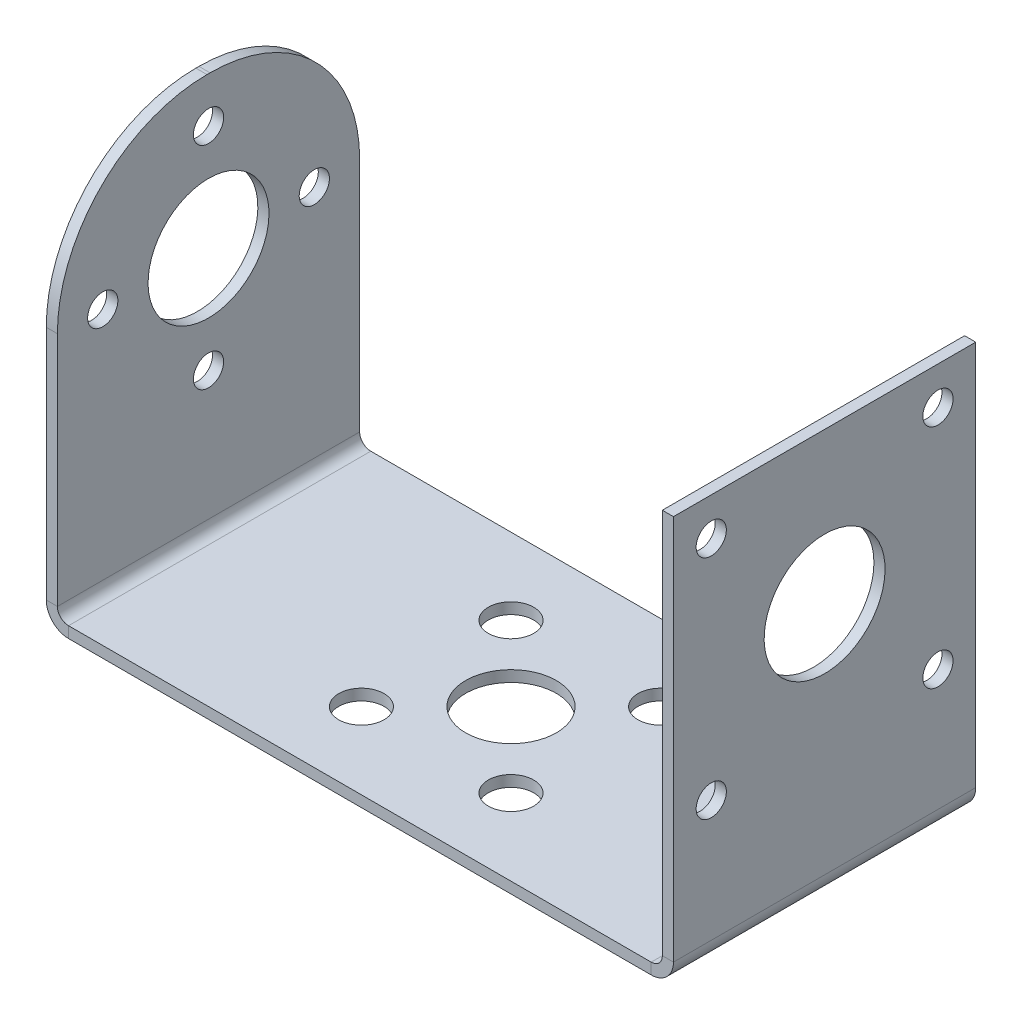
ISO-10303-21;
HEADER;
FILE_DESCRIPTION(('STEP AP214'),'2;1');
FILE_NAME('part.step','',(''),(''),'','','');
FILE_SCHEMA(('AUTOMOTIVE_DESIGN { 1 0 10303 214 1 1 1 1 }'));
ENDSEC;
DATA;
#1=APPLICATION_CONTEXT('core data for automotive mechanical design processes');
#2=APPLICATION_PROTOCOL_DEFINITION('international standard','automotive_design',2000,#1);
#3=PRODUCT_CONTEXT('',#1,'mechanical');
#4=PRODUCT('Part','Part','',(#3));
#5=PRODUCT_RELATED_PRODUCT_CATEGORY('part','',(#4));
#6=PRODUCT_DEFINITION_FORMATION('','',#4);
#7=PRODUCT_DEFINITION_CONTEXT('part definition',#1,'design');
#8=PRODUCT_DEFINITION('design','',#6,#7);
#9=PRODUCT_DEFINITION_SHAPE('','',#8);
#10=(LENGTH_UNIT() NAMED_UNIT(*) SI_UNIT(.MILLI.,.METRE.));
#11=(NAMED_UNIT(*) PLANE_ANGLE_UNIT() SI_UNIT($,.RADIAN.));
#12=(NAMED_UNIT(*) SI_UNIT($,.STERADIAN.) SOLID_ANGLE_UNIT());
#13=UNCERTAINTY_MEASURE_WITH_UNIT(LENGTH_MEASURE(1.E-05),#10,'distance_accuracy_value','');
#14=(GEOMETRIC_REPRESENTATION_CONTEXT(3) GLOBAL_UNCERTAINTY_ASSIGNED_CONTEXT((#13)) GLOBAL_UNIT_ASSIGNED_CONTEXT((#10,
#11,#12)) REPRESENTATION_CONTEXT('',''));
#15=CARTESIAN_POINT('',(0.,0.,0.));
#16=DIRECTION('',(0.,0.,1.));
#17=DIRECTION('',(1.,0.,0.));
#18=AXIS2_PLACEMENT_3D('',#15,#16,#17);
#19=CARTESIAN_POINT('',(0.,-0.7366,0.));
#20=DIRECTION('',(0.,1.,0.));
#21=DIRECTION('',(0.,0.,1.));
#22=AXIS2_PLACEMENT_3D('',#19,#20,#21);
#23=PLANE('',#22);
#24=CARTESIAN_POINT('',(4.94950000000001,-0.7366,4.9495));
#25=DIRECTION('',(0.,1.,0.));
#26=DIRECTION('',(0.,0.,1.));
#27=AXIS2_PLACEMENT_3D('',#24,#25,#26);
#28=CIRCLE('',#27,1.5);
#29=CARTESIAN_POINT('',(4.94950000000001,-0.7366,6.4495));
#30=VERTEX_POINT('',#29);
#31=EDGE_CURVE('E356',#30,#30,#28,.T.);
#32=ORIENTED_EDGE('',*,*,#31,.T.);
#33=EDGE_LOOP('',(#32));
#34=FACE_BOUND('',#33,.T.);
#35=CARTESIAN_POINT('',(-4.94949999999999,-0.7366,4.9495));
#36=DIRECTION('',(0.,1.,0.));
#37=DIRECTION('',(0.,0.,1.));
#38=AXIS2_PLACEMENT_3D('',#35,#36,#37);
#39=CIRCLE('',#38,1.5);
#40=CARTESIAN_POINT('',(-4.94949999999999,-0.7366,6.4495));
#41=VERTEX_POINT('',#40);
#42=EDGE_CURVE('E362',#41,#41,#39,.T.);
#43=ORIENTED_EDGE('',*,*,#42,.T.);
#44=EDGE_LOOP('',(#43));
#45=FACE_BOUND('',#44,.T.);
#46=CARTESIAN_POINT('',(-4.94949999999999,-0.7366,-4.9495));
#47=DIRECTION('',(0.,1.,0.));
#48=DIRECTION('',(0.,0.,1.));
#49=AXIS2_PLACEMENT_3D('',#46,#47,#48);
#50=CIRCLE('',#49,1.5);
#51=CARTESIAN_POINT('',(-4.94949999999999,-0.7366,-3.4495));
#52=VERTEX_POINT('',#51);
#53=EDGE_CURVE('E368',#52,#52,#50,.T.);
#54=ORIENTED_EDGE('',*,*,#53,.T.);
#55=EDGE_LOOP('',(#54));
#56=FACE_BOUND('',#55,.T.);
#57=CARTESIAN_POINT('',(4.94950000000001,-0.7366,-4.9495));
#58=DIRECTION('',(0.,1.,0.));
#59=DIRECTION('',(0.,0.,1.));
#60=AXIS2_PLACEMENT_3D('',#57,#58,#59);
#61=CIRCLE('',#60,1.5);
#62=CARTESIAN_POINT('',(4.94950000000001,-0.7366,-3.4495));
#63=VERTEX_POINT('',#62);
#64=EDGE_CURVE('E374',#63,#63,#61,.T.);
#65=ORIENTED_EDGE('',*,*,#64,.T.);
#66=EDGE_LOOP('',(#65));
#67=FACE_BOUND('',#66,.T.);
#68=CARTESIAN_POINT('',(0.,-0.7366,0.));
#69=DIRECTION('',(0.,1.,0.));
#70=DIRECTION('',(0.,0.,1.));
#71=AXIS2_PLACEMENT_3D('',#68,#69,#70);
#72=CIRCLE('',#71,3.);
#73=CARTESIAN_POINT('',(0.,-0.7366,3.));
#74=VERTEX_POINT('',#73);
#75=EDGE_CURVE('E380',#74,#74,#72,.T.);
#76=ORIENTED_EDGE('',*,*,#75,.T.);
#77=EDGE_LOOP('',(#76));
#78=FACE_BOUND('',#77,.T.);
#79=DIRECTION('',(0.,0.,-1.));
#80=VECTOR('',#79,1.);
#81=CARTESIAN_POINT('',(19.2768,-0.736600000000001,-10.));
#82=LINE('',#81,#80);
#83=CARTESIAN_POINT('',(19.2768,-0.736600000000001,-10.));
#84=VERTEX_POINT('',#83);
#85=CARTESIAN_POINT('',(19.2768,-0.7366,10.));
#86=VERTEX_POINT('',#85);
#87=EDGE_CURVE('E238',#84,#86,#82,.F.);
#88=ORIENTED_EDGE('',*,*,#87,.T.);
#89=DIRECTION('',(1.,0.,0.));
#90=VECTOR('',#89,1.);
#91=CARTESIAN_POINT('',(-20.75,-0.7366,10.));
#92=LINE('',#91,#90);
#93=CARTESIAN_POINT('',(-19.2768,-0.736600000000001,10.));
#94=VERTEX_POINT('',#93);
#95=EDGE_CURVE('E13',#94,#86,#92,.T.);
#96=ORIENTED_EDGE('',*,*,#95,.F.);
#97=DIRECTION('',(0.,0.,1.));
#98=VECTOR('',#97,1.);
#99=CARTESIAN_POINT('',(-19.2768,-0.736600000000001,10.));
#100=LINE('',#99,#98);
#101=CARTESIAN_POINT('',(-19.2768,-0.7366,-10.));
#102=VERTEX_POINT('',#101);
#103=EDGE_CURVE('E335',#94,#102,#100,.F.);
#104=ORIENTED_EDGE('',*,*,#103,.T.);
#105=DIRECTION('',(-1.,0.,0.));
#106=VECTOR('',#105,1.);
#107=CARTESIAN_POINT('',(-20.75,-0.7366,-10.));
#108=LINE('',#107,#106);
#109=EDGE_CURVE('E102',#84,#102,#108,.T.);
#110=ORIENTED_EDGE('',*,*,#109,.F.);
#111=EDGE_LOOP('',(#88,#96,#104,#110));
#112=FACE_BOUND('',#111,.T.);
#113=ADVANCED_FACE('F93',(#34,#45,#56,#67,#78,#112),#23,.F.);
#114=CARTESIAN_POINT('',(0.,0.,0.));
#115=DIRECTION('',(0.,1.,0.));
#116=DIRECTION('',(0.,0.,1.));
#117=AXIS2_PLACEMENT_3D('',#114,#115,#116);
#118=PLANE('',#117);
#119=CARTESIAN_POINT('',(4.94950000000001,0.,4.9495));
#120=DIRECTION('',(0.,1.,0.));
#121=DIRECTION('',(0.,0.,1.));
#122=AXIS2_PLACEMENT_3D('',#119,#120,#121);
#123=CIRCLE('',#122,1.5);
#124=CARTESIAN_POINT('',(4.94950000000001,0.,6.4495));
#125=VERTEX_POINT('',#124);
#126=EDGE_CURVE('E353',#125,#125,#123,.T.);
#127=ORIENTED_EDGE('',*,*,#126,.F.);
#128=EDGE_LOOP('',(#127));
#129=FACE_BOUND('',#128,.T.);
#130=CARTESIAN_POINT('',(-4.94949999999999,0.,4.9495));
#131=DIRECTION('',(0.,1.,0.));
#132=DIRECTION('',(0.,0.,1.));
#133=AXIS2_PLACEMENT_3D('',#130,#131,#132);
#134=CIRCLE('',#133,1.5);
#135=CARTESIAN_POINT('',(-4.94949999999999,0.,6.4495));
#136=VERTEX_POINT('',#135);
#137=EDGE_CURVE('E359',#136,#136,#134,.T.);
#138=ORIENTED_EDGE('',*,*,#137,.F.);
#139=EDGE_LOOP('',(#138));
#140=FACE_BOUND('',#139,.T.);
#141=CARTESIAN_POINT('',(-4.94949999999999,0.,-4.9495));
#142=DIRECTION('',(0.,1.,0.));
#143=DIRECTION('',(0.,0.,1.));
#144=AXIS2_PLACEMENT_3D('',#141,#142,#143);
#145=CIRCLE('',#144,1.5);
#146=CARTESIAN_POINT('',(-4.94949999999999,0.,-3.4495));
#147=VERTEX_POINT('',#146);
#148=EDGE_CURVE('E365',#147,#147,#145,.T.);
#149=ORIENTED_EDGE('',*,*,#148,.F.);
#150=EDGE_LOOP('',(#149));
#151=FACE_BOUND('',#150,.T.);
#152=CARTESIAN_POINT('',(4.94950000000001,0.,-4.9495));
#153=DIRECTION('',(0.,1.,0.));
#154=DIRECTION('',(0.,0.,1.));
#155=AXIS2_PLACEMENT_3D('',#152,#153,#154);
#156=CIRCLE('',#155,1.5);
#157=CARTESIAN_POINT('',(4.94950000000001,0.,-3.4495));
#158=VERTEX_POINT('',#157);
#159=EDGE_CURVE('E371',#158,#158,#156,.T.);
#160=ORIENTED_EDGE('',*,*,#159,.F.);
#161=EDGE_LOOP('',(#160));
#162=FACE_BOUND('',#161,.T.);
#163=CARTESIAN_POINT('',(0.,0.,0.));
#164=DIRECTION('',(0.,1.,0.));
#165=DIRECTION('',(0.,0.,1.));
#166=AXIS2_PLACEMENT_3D('',#163,#164,#165);
#167=CIRCLE('',#166,3.);
#168=CARTESIAN_POINT('',(0.,0.,3.));
#169=VERTEX_POINT('',#168);
#170=EDGE_CURVE('E377',#169,#169,#167,.T.);
#171=ORIENTED_EDGE('',*,*,#170,.F.);
#172=EDGE_LOOP('',(#171));
#173=FACE_BOUND('',#172,.T.);
#174=DIRECTION('',(1.,0.,0.));
#175=VECTOR('',#174,1.);
#176=CARTESIAN_POINT('',(-20.75,0.,10.));
#177=LINE('',#176,#175);
#178=CARTESIAN_POINT('',(-19.2768,0.,10.));
#179=VERTEX_POINT('',#178);
#180=CARTESIAN_POINT('',(19.2768,0.,10.));
#181=VERTEX_POINT('',#180);
#182=EDGE_CURVE('E386',#179,#181,#177,.T.);
#183=ORIENTED_EDGE('',*,*,#182,.T.);
#184=DIRECTION('',(0.,0.,-1.));
#185=VECTOR('',#184,1.);
#186=CARTESIAN_POINT('',(19.2768,0.,-10.));
#187=LINE('',#186,#185);
#188=CARTESIAN_POINT('',(19.2768,0.,-10.));
#189=VERTEX_POINT('',#188);
#190=EDGE_CURVE('E250',#189,#181,#187,.F.);
#191=ORIENTED_EDGE('',*,*,#190,.F.);
#192=DIRECTION('',(-1.,0.,0.));
#193=VECTOR('',#192,1.);
#194=CARTESIAN_POINT('',(-20.75,0.,-10.));
#195=LINE('',#194,#193);
#196=CARTESIAN_POINT('',(-19.2768,0.,-10.));
#197=VERTEX_POINT('',#196);
#198=EDGE_CURVE('E383',#189,#197,#195,.T.);
#199=ORIENTED_EDGE('',*,*,#198,.T.);
#200=DIRECTION('',(0.,0.,1.));
#201=VECTOR('',#200,1.);
#202=CARTESIAN_POINT('',(-19.2768,0.,10.));
#203=LINE('',#202,#201);
#204=EDGE_CURVE('E110',#179,#197,#203,.F.);
#205=ORIENTED_EDGE('',*,*,#204,.F.);
#206=EDGE_LOOP('',(#183,#191,#199,#205));
#207=FACE_BOUND('',#206,.T.);
#208=ADVANCED_FACE('F464',(#129,#140,#151,#162,#173,#207),#118,.T.);
#209=CARTESIAN_POINT('',(-20.75,-0.7366,-10.));
#210=DIRECTION('',(0.,0.,-1.));
#211=DIRECTION('',(-1.,0.,0.));
#212=AXIS2_PLACEMENT_3D('',#209,#210,#211);
#213=PLANE('',#212);
#214=ORIENTED_EDGE('',*,*,#198,.F.);
#215=DIRECTION('',(0.,-1.,0.));
#216=VECTOR('',#215,1.);
#217=CARTESIAN_POINT('',(19.2768,0.,-10.));
#218=LINE('',#217,#216);
#219=EDGE_CURVE('E244',#189,#84,#218,.T.);
#220=ORIENTED_EDGE('',*,*,#219,.T.);
#221=ORIENTED_EDGE('',*,*,#109,.T.);
#222=DIRECTION('',(0.,-1.,0.));
#223=VECTOR('',#222,1.);
#224=CARTESIAN_POINT('',(-19.2768,0.,-10.));
#225=LINE('',#224,#223);
#226=EDGE_CURVE('E350',#197,#102,#225,.T.);
#227=ORIENTED_EDGE('',*,*,#226,.F.);
#228=EDGE_LOOP('',(#214,#220,#221,#227));
#229=FACE_BOUND('',#228,.T.);
#230=ADVANCED_FACE('F95',(#229),#213,.T.);
#231=CARTESIAN_POINT('',(-20.75,-0.7366,10.));
#232=DIRECTION('',(0.,0.,1.));
#233=DIRECTION('',(1.,0.,0.));
#234=AXIS2_PLACEMENT_3D('',#231,#232,#233);
#235=PLANE('',#234);
#236=DIRECTION('',(0.,-1.,0.));
#237=VECTOR('',#236,1.);
#238=CARTESIAN_POINT('',(19.2768,0.,10.));
#239=LINE('',#238,#237);
#240=EDGE_CURVE('E256',#181,#86,#239,.T.);
#241=ORIENTED_EDGE('',*,*,#240,.F.);
#242=ORIENTED_EDGE('',*,*,#182,.F.);
#243=DIRECTION('',(0.,-1.,0.));
#244=VECTOR('',#243,1.);
#245=CARTESIAN_POINT('',(-19.2768,0.,10.));
#246=LINE('',#245,#244);
#247=EDGE_CURVE('E341',#179,#94,#246,.T.);
#248=ORIENTED_EDGE('',*,*,#247,.T.);
#249=ORIENTED_EDGE('',*,*,#95,.T.);
#250=EDGE_LOOP('',(#241,#242,#248,#249));
#251=FACE_BOUND('',#250,.T.);
#252=ADVANCED_FACE('F476',(#251),#235,.T.);
#253=CARTESIAN_POINT('',(0.,-0.7366,0.));
#254=DIRECTION('',(0.,1.,0.));
#255=DIRECTION('',(0.,0.,1.));
#256=AXIS2_PLACEMENT_3D('',#253,#254,#255);
#257=CYLINDRICAL_SURFACE('',#256,3.);
#258=ORIENTED_EDGE('',*,*,#75,.F.);
#259=EDGE_LOOP('',(#258));
#260=FACE_BOUND('',#259,.T.);
#261=ORIENTED_EDGE('',*,*,#170,.T.);
#262=EDGE_LOOP('',(#261));
#263=FACE_BOUND('',#262,.T.);
#264=ADVANCED_FACE('F474',(#260,#263),#257,.F.);
#265=CARTESIAN_POINT('',(4.94950000000001,-0.7366,-4.9495));
#266=DIRECTION('',(0.,1.,0.));
#267=DIRECTION('',(0.,0.,1.));
#268=AXIS2_PLACEMENT_3D('',#265,#266,#267);
#269=CYLINDRICAL_SURFACE('',#268,1.5);
#270=ORIENTED_EDGE('',*,*,#64,.F.);
#271=EDGE_LOOP('',(#270));
#272=FACE_BOUND('',#271,.T.);
#273=ORIENTED_EDGE('',*,*,#159,.T.);
#274=EDGE_LOOP('',(#273));
#275=FACE_BOUND('',#274,.T.);
#276=ADVANCED_FACE('F483',(#272,#275),#269,.F.);
#277=CARTESIAN_POINT('',(-4.94949999999999,-0.7366,-4.9495));
#278=DIRECTION('',(0.,1.,0.));
#279=DIRECTION('',(0.,0.,1.));
#280=AXIS2_PLACEMENT_3D('',#277,#278,#279);
#281=CYLINDRICAL_SURFACE('',#280,1.5);
#282=ORIENTED_EDGE('',*,*,#53,.F.);
#283=EDGE_LOOP('',(#282));
#284=FACE_BOUND('',#283,.T.);
#285=ORIENTED_EDGE('',*,*,#148,.T.);
#286=EDGE_LOOP('',(#285));
#287=FACE_BOUND('',#286,.T.);
#288=ADVANCED_FACE('F570',(#284,#287),#281,.F.);
#289=CARTESIAN_POINT('',(-4.94949999999999,-0.7366,4.9495));
#290=DIRECTION('',(0.,1.,0.));
#291=DIRECTION('',(0.,0.,1.));
#292=AXIS2_PLACEMENT_3D('',#289,#290,#291);
#293=CYLINDRICAL_SURFACE('',#292,1.5);
#294=ORIENTED_EDGE('',*,*,#42,.F.);
#295=EDGE_LOOP('',(#294));
#296=FACE_BOUND('',#295,.T.);
#297=ORIENTED_EDGE('',*,*,#137,.T.);
#298=EDGE_LOOP('',(#297));
#299=FACE_BOUND('',#298,.T.);
#300=ADVANCED_FACE('F566',(#296,#299),#293,.F.);
#301=CARTESIAN_POINT('',(4.94950000000001,-0.7366,4.9495));
#302=DIRECTION('',(0.,1.,0.));
#303=DIRECTION('',(0.,0.,1.));
#304=AXIS2_PLACEMENT_3D('',#301,#302,#303);
#305=CYLINDRICAL_SURFACE('',#304,1.5);
#306=ORIENTED_EDGE('',*,*,#31,.F.);
#307=EDGE_LOOP('',(#306));
#308=FACE_BOUND('',#307,.T.);
#309=ORIENTED_EDGE('',*,*,#126,.T.);
#310=EDGE_LOOP('',(#309));
#311=FACE_BOUND('',#310,.T.);
#312=ADVANCED_FACE('F561',(#308,#311),#305,.F.);
#313=CARTESIAN_POINT('',(-19.2768,0.7366,-10.));
#314=DIRECTION('',(0.,0.,-1.));
#315=DIRECTION('',(-1.,0.,0.));
#316=AXIS2_PLACEMENT_3D('',#313,#314,#315);
#317=PLANE('',#316);
#318=DIRECTION('',(1.,0.,0.));
#319=VECTOR('',#318,1.);
#320=CARTESIAN_POINT('',(-20.75,0.736599999999994,-10.));
#321=LINE('',#320,#319);
#322=CARTESIAN_POINT('',(-20.0134,0.736599999999997,-10.));
#323=VERTEX_POINT('',#322);
#324=CARTESIAN_POINT('',(-20.75,0.736599999999994,-10.));
#325=VERTEX_POINT('',#324);
#326=EDGE_CURVE('E259',#323,#325,#321,.F.);
#327=ORIENTED_EDGE('',*,*,#326,.F.);
#328=CARTESIAN_POINT('',(-19.2768,0.7366,-10.));
#329=DIRECTION('',(0.,0.,1.));
#330=DIRECTION('',(1.,0.,0.));
#331=AXIS2_PLACEMENT_3D('',#328,#329,#330);
#332=CIRCLE('',#331,0.7366);
#333=EDGE_CURVE('E344',#197,#323,#332,.F.);
#334=ORIENTED_EDGE('',*,*,#333,.F.);
#335=ORIENTED_EDGE('',*,*,#226,.T.);
#336=CARTESIAN_POINT('',(-19.2768,0.7366,-10.));
#337=DIRECTION('',(0.,0.,1.));
#338=DIRECTION('',(1.,0.,0.));
#339=AXIS2_PLACEMENT_3D('',#336,#337,#338);
#340=CIRCLE('',#339,1.4732);
#341=EDGE_CURVE('E337',#102,#325,#340,.F.);
#342=ORIENTED_EDGE('',*,*,#341,.T.);
#343=EDGE_LOOP('',(#327,#334,#335,#342));
#344=FACE_BOUND('',#343,.T.);
#345=ADVANCED_FACE('F506',(#344),#317,.T.);
#346=CARTESIAN_POINT('',(-19.2768,0.7366,10.));
#347=DIRECTION('',(0.,0.,-1.));
#348=DIRECTION('',(-1.,0.,0.));
#349=AXIS2_PLACEMENT_3D('',#346,#347,#348);
#350=PLANE('',#349);
#351=CARTESIAN_POINT('',(-19.2768,0.7366,10.));
#352=DIRECTION('',(0.,0.,1.));
#353=DIRECTION('',(1.,0.,0.));
#354=AXIS2_PLACEMENT_3D('',#351,#352,#353);
#355=CIRCLE('',#354,0.7366);
#356=CARTESIAN_POINT('',(-20.0134,0.736599999999997,10.));
#357=VERTEX_POINT('',#356);
#358=EDGE_CURVE('E274',#357,#179,#355,.T.);
#359=ORIENTED_EDGE('',*,*,#358,.F.);
#360=DIRECTION('',(1.,0.,0.));
#361=VECTOR('',#360,1.);
#362=CARTESIAN_POINT('',(-20.0134,0.736599999999997,10.));
#363=LINE('',#362,#361);
#364=CARTESIAN_POINT('',(-20.75,0.736599999999994,10.));
#365=VERTEX_POINT('',#364);
#366=EDGE_CURVE('E328',#357,#365,#363,.F.);
#367=ORIENTED_EDGE('',*,*,#366,.T.);
#368=CARTESIAN_POINT('',(-19.2768,0.7366,10.));
#369=DIRECTION('',(0.,0.,1.));
#370=DIRECTION('',(1.,0.,0.));
#371=AXIS2_PLACEMENT_3D('',#368,#369,#370);
#372=CIRCLE('',#371,1.4732);
#373=EDGE_CURVE('E338',#365,#94,#372,.T.);
#374=ORIENTED_EDGE('',*,*,#373,.T.);
#375=ORIENTED_EDGE('',*,*,#247,.F.);
#376=EDGE_LOOP('',(#359,#367,#374,#375));
#377=FACE_BOUND('',#376,.T.);
#378=ADVANCED_FACE('F530',(#377),#350,.F.);
#379=CARTESIAN_POINT('',(-19.2768,0.7366,10.));
#380=DIRECTION('',(0.,0.,1.));
#381=DIRECTION('',(-1.,0.,0.));
#382=AXIS2_PLACEMENT_3D('',#379,#380,#381);
#383=CYLINDRICAL_SURFACE('',#382,1.4732);
#384=ORIENTED_EDGE('',*,*,#103,.F.);
#385=ORIENTED_EDGE('',*,*,#373,.F.);
#386=DIRECTION('',(0.,0.,1.));
#387=VECTOR('',#386,1.);
#388=CARTESIAN_POINT('',(-20.75,0.736599999999994,-10.));
#389=LINE('',#388,#387);
#390=EDGE_CURVE('E326',#365,#325,#389,.F.);
#391=ORIENTED_EDGE('',*,*,#390,.T.);
#392=ORIENTED_EDGE('',*,*,#341,.F.);
#393=EDGE_LOOP('',(#384,#385,#391,#392));
#394=FACE_BOUND('',#393,.T.);
#395=ADVANCED_FACE('F553',(#394),#383,.T.);
#396=CARTESIAN_POINT('',(-19.2768,0.7366,10.));
#397=DIRECTION('',(0.,0.,1.));
#398=DIRECTION('',(-1.,0.,0.));
#399=AXIS2_PLACEMENT_3D('',#396,#397,#398);
#400=CYLINDRICAL_SURFACE('',#399,0.7366);
#401=ORIENTED_EDGE('',*,*,#204,.T.);
#402=ORIENTED_EDGE('',*,*,#333,.T.);
#403=DIRECTION('',(0.,0.,1.));
#404=VECTOR('',#403,1.);
#405=CARTESIAN_POINT('',(-20.0134,0.736599999999997,-10.));
#406=LINE('',#405,#404);
#407=EDGE_CURVE('E331',#323,#357,#406,.T.);
#408=ORIENTED_EDGE('',*,*,#407,.T.);
#409=ORIENTED_EDGE('',*,*,#358,.T.);
#410=EDGE_LOOP('',(#401,#402,#408,#409));
#411=FACE_BOUND('',#410,.T.);
#412=ADVANCED_FACE('F504',(#411),#400,.F.);
#413=CARTESIAN_POINT('',(-20.7500000000001,16.3634,0.0999999999999994));
#414=DIRECTION('',(1.,0.,0.));
#415=DIRECTION('',(0.,1.,0.));
#416=AXIS2_PLACEMENT_3D('',#413,#414,#415);
#417=PLANE('',#416);
#418=CARTESIAN_POINT('',(-20.75,9.2634,0.));
#419=DIRECTION('',(1.,0.,0.));
#420=DIRECTION('',(0.,1.,0.));
#421=AXIS2_PLACEMENT_3D('',#418,#419,#420);
#422=CIRCLE('',#421,1.);
#423=CARTESIAN_POINT('',(-20.75,10.2634,0.));
#424=VERTEX_POINT('',#423);
#425=EDGE_CURVE('E320',#424,#424,#422,.F.);
#426=ORIENTED_EDGE('',*,*,#425,.F.);
#427=EDGE_LOOP('',(#426));
#428=FACE_BOUND('',#427,.T.);
#429=CARTESIAN_POINT('',(-20.7500000000001,16.2634,7.));
#430=DIRECTION('',(1.,0.,0.));
#431=DIRECTION('',(0.,1.,0.));
#432=AXIS2_PLACEMENT_3D('',#429,#430,#431);
#433=CIRCLE('',#432,1.);
#434=CARTESIAN_POINT('',(-20.7500000000001,17.2634,7.));
#435=VERTEX_POINT('',#434);
#436=EDGE_CURVE('E314',#435,#435,#433,.F.);
#437=ORIENTED_EDGE('',*,*,#436,.F.);
#438=EDGE_LOOP('',(#437));
#439=FACE_BOUND('',#438,.T.);
#440=CARTESIAN_POINT('',(-20.7500000000001,16.2634,-7.));
#441=DIRECTION('',(1.,0.,0.));
#442=DIRECTION('',(0.,1.,0.));
#443=AXIS2_PLACEMENT_3D('',#440,#441,#442);
#444=CIRCLE('',#443,1.);
#445=CARTESIAN_POINT('',(-20.7500000000001,17.2634,-7.));
#446=VERTEX_POINT('',#445);
#447=EDGE_CURVE('E308',#446,#446,#444,.F.);
#448=ORIENTED_EDGE('',*,*,#447,.F.);
#449=EDGE_LOOP('',(#448));
#450=FACE_BOUND('',#449,.T.);
#451=CARTESIAN_POINT('',(-20.7500000000001,23.2634,0.));
#452=DIRECTION('',(1.,0.,0.));
#453=DIRECTION('',(0.,1.,0.));
#454=AXIS2_PLACEMENT_3D('',#451,#452,#453);
#455=CIRCLE('',#454,1.);
#456=CARTESIAN_POINT('',(-20.7500000000001,24.2634,0.));
#457=VERTEX_POINT('',#456);
#458=EDGE_CURVE('E302',#457,#457,#455,.F.);
#459=ORIENTED_EDGE('',*,*,#458,.F.);
#460=EDGE_LOOP('',(#459));
#461=FACE_BOUND('',#460,.T.);
#462=CARTESIAN_POINT('',(-20.7500000000001,16.2634,0.));
#463=DIRECTION('',(1.,0.,0.));
#464=DIRECTION('',(0.,1.,0.));
#465=AXIS2_PLACEMENT_3D('',#462,#463,#464);
#466=CIRCLE('',#465,4.);
#467=CARTESIAN_POINT('',(-20.7500000000001,20.2634,0.));
#468=VERTEX_POINT('',#467);
#469=EDGE_CURVE('E296',#468,#468,#466,.F.);
#470=ORIENTED_EDGE('',*,*,#469,.F.);
#471=EDGE_LOOP('',(#470));
#472=FACE_BOUND('',#471,.T.);
#473=ORIENTED_EDGE('',*,*,#390,.F.);
#474=DIRECTION('',(0.,1.,0.));
#475=VECTOR('',#474,1.);
#476=CARTESIAN_POINT('',(-20.7500000000001,16.3634,10.));
#477=LINE('',#476,#475);
#478=CARTESIAN_POINT('',(-20.7500000000001,16.3634,10.));
#479=VERTEX_POINT('',#478);
#480=EDGE_CURVE('E283',#365,#479,#477,.T.);
#481=ORIENTED_EDGE('',*,*,#480,.T.);
#482=CARTESIAN_POINT('',(-20.7500000000001,16.3634,0.0999999999999994));
#483=DIRECTION('',(1.,0.,0.));
#484=DIRECTION('',(0.,1.,0.));
#485=AXIS2_PLACEMENT_3D('',#482,#483,#484);
#486=CIRCLE('',#485,9.9);
#487=CARTESIAN_POINT('',(-20.7500000000001,26.2634,0.0999999999999994));
#488=VERTEX_POINT('',#487);
#489=EDGE_CURVE('E281',#479,#488,#486,.F.);
#490=ORIENTED_EDGE('',*,*,#489,.T.);
#491=DIRECTION('',(0.,0.,-1.));
#492=VECTOR('',#491,1.);
#493=CARTESIAN_POINT('',(-20.7500000000001,26.2634,0.0999999999999994));
#494=LINE('',#493,#492);
#495=CARTESIAN_POINT('',(-20.7500000000001,26.2634,-0.0999999999999977));
#496=VERTEX_POINT('',#495);
#497=EDGE_CURVE('E279',#488,#496,#494,.T.);
#498=ORIENTED_EDGE('',*,*,#497,.T.);
#499=CARTESIAN_POINT('',(-20.7500000000001,16.3634,-0.0999999999999977));
#500=DIRECTION('',(1.,0.,0.));
#501=DIRECTION('',(0.,1.,0.));
#502=AXIS2_PLACEMENT_3D('',#499,#500,#501);
#503=CIRCLE('',#502,9.9);
#504=CARTESIAN_POINT('',(-20.7500000000001,16.3634,-10.));
#505=VERTEX_POINT('',#504);
#506=EDGE_CURVE('E277',#496,#505,#503,.F.);
#507=ORIENTED_EDGE('',*,*,#506,.T.);
#508=DIRECTION('',(0.,-1.,0.));
#509=VECTOR('',#508,1.);
#510=CARTESIAN_POINT('',(-20.7500000000001,16.3634,-10.));
#511=LINE('',#510,#509);
#512=EDGE_CURVE('E265',#505,#325,#511,.T.);
#513=ORIENTED_EDGE('',*,*,#512,.T.);
#514=EDGE_LOOP('',(#473,#481,#490,#498,#507,#513));
#515=FACE_BOUND('',#514,.T.);
#516=ADVANCED_FACE('F514',(#428,#439,#450,#461,#472,#515),#417,.F.);
#517=CARTESIAN_POINT('',(-20.0134000000001,16.3634,0.0999999999999994));
#518=DIRECTION('',(1.,0.,0.));
#519=DIRECTION('',(0.,1.,0.));
#520=AXIS2_PLACEMENT_3D('',#517,#518,#519);
#521=PLANE('',#520);
#522=CARTESIAN_POINT('',(-20.0134000000001,16.2634,7.));
#523=DIRECTION('',(1.,0.,0.));
#524=DIRECTION('',(0.,1.,0.));
#525=AXIS2_PLACEMENT_3D('',#522,#523,#524);
#526=CIRCLE('',#525,1.);
#527=CARTESIAN_POINT('',(-20.0134000000001,17.2634,7.));
#528=VERTEX_POINT('',#527);
#529=EDGE_CURVE('E317',#528,#528,#526,.F.);
#530=ORIENTED_EDGE('',*,*,#529,.T.);
#531=EDGE_LOOP('',(#530));
#532=FACE_BOUND('',#531,.T.);
#533=CARTESIAN_POINT('',(-20.0134000000001,23.2634,0.));
#534=DIRECTION('',(1.,0.,0.));
#535=DIRECTION('',(0.,1.,0.));
#536=AXIS2_PLACEMENT_3D('',#533,#534,#535);
#537=CIRCLE('',#536,1.);
#538=CARTESIAN_POINT('',(-20.0134000000001,24.2634,0.));
#539=VERTEX_POINT('',#538);
#540=EDGE_CURVE('E305',#539,#539,#537,.F.);
#541=ORIENTED_EDGE('',*,*,#540,.T.);
#542=EDGE_LOOP('',(#541));
#543=FACE_BOUND('',#542,.T.);
#544=CARTESIAN_POINT('',(-20.0134000000001,16.2634,0.));
#545=DIRECTION('',(1.,0.,0.));
#546=DIRECTION('',(0.,1.,0.));
#547=AXIS2_PLACEMENT_3D('',#544,#545,#546);
#548=CIRCLE('',#547,4.);
#549=CARTESIAN_POINT('',(-20.0134000000001,20.2634,0.));
#550=VERTEX_POINT('',#549);
#551=EDGE_CURVE('E299',#550,#550,#548,.F.);
#552=ORIENTED_EDGE('',*,*,#551,.T.);
#553=EDGE_LOOP('',(#552));
#554=FACE_BOUND('',#553,.T.);
#555=CARTESIAN_POINT('',(-20.0134000000001,16.2634,-7.));
#556=DIRECTION('',(1.,0.,0.));
#557=DIRECTION('',(0.,1.,0.));
#558=AXIS2_PLACEMENT_3D('',#555,#556,#557);
#559=CIRCLE('',#558,1.);
#560=CARTESIAN_POINT('',(-20.0134000000001,17.2634,-7.));
#561=VERTEX_POINT('',#560);
#562=EDGE_CURVE('E311',#561,#561,#559,.F.);
#563=ORIENTED_EDGE('',*,*,#562,.T.);
#564=EDGE_LOOP('',(#563));
#565=FACE_BOUND('',#564,.T.);
#566=CARTESIAN_POINT('',(-20.0134,9.2634,0.));
#567=DIRECTION('',(1.,0.,0.));
#568=DIRECTION('',(0.,1.,0.));
#569=AXIS2_PLACEMENT_3D('',#566,#567,#568);
#570=CIRCLE('',#569,1.);
#571=CARTESIAN_POINT('',(-20.0134,10.2634,0.));
#572=VERTEX_POINT('',#571);
#573=EDGE_CURVE('E323',#572,#572,#570,.F.);
#574=ORIENTED_EDGE('',*,*,#573,.T.);
#575=EDGE_LOOP('',(#574));
#576=FACE_BOUND('',#575,.T.);
#577=DIRECTION('',(0.,-1.,0.));
#578=VECTOR('',#577,1.);
#579=CARTESIAN_POINT('',(-20.0134000000001,16.3634,10.));
#580=LINE('',#579,#578);
#581=CARTESIAN_POINT('',(-20.0134000000001,16.3634,10.));
#582=VERTEX_POINT('',#581);
#583=EDGE_CURVE('E294',#357,#582,#580,.F.);
#584=ORIENTED_EDGE('',*,*,#583,.F.);
#585=ORIENTED_EDGE('',*,*,#407,.F.);
#586=DIRECTION('',(0.,1.,0.));
#587=VECTOR('',#586,1.);
#588=CARTESIAN_POINT('',(-20.0134,0.,-10.));
#589=LINE('',#588,#587);
#590=CARTESIAN_POINT('',(-20.0134000000001,16.3634,-10.));
#591=VERTEX_POINT('',#590);
#592=EDGE_CURVE('E285',#591,#323,#589,.F.);
#593=ORIENTED_EDGE('',*,*,#592,.F.);
#594=CARTESIAN_POINT('',(-20.0134000000001,16.3634,-0.0999999999999977));
#595=DIRECTION('',(1.,0.,0.));
#596=DIRECTION('',(0.,1.,0.));
#597=AXIS2_PLACEMENT_3D('',#594,#595,#596);
#598=CIRCLE('',#597,9.9);
#599=CARTESIAN_POINT('',(-20.0134000000001,26.2634,-0.0999999999999977));
#600=VERTEX_POINT('',#599);
#601=EDGE_CURVE('E288',#600,#591,#598,.F.);
#602=ORIENTED_EDGE('',*,*,#601,.F.);
#603=DIRECTION('',(0.,0.,1.));
#604=VECTOR('',#603,1.);
#605=CARTESIAN_POINT('',(-20.0134000000001,26.2634,-0.0999999999999977));
#606=LINE('',#605,#604);
#607=CARTESIAN_POINT('',(-20.0134000000001,26.2634,0.0999999999999994));
#608=VERTEX_POINT('',#607);
#609=EDGE_CURVE('E290',#608,#600,#606,.F.);
#610=ORIENTED_EDGE('',*,*,#609,.F.);
#611=CARTESIAN_POINT('',(-20.0134000000001,16.3634,0.0999999999999994));
#612=DIRECTION('',(1.,0.,0.));
#613=DIRECTION('',(0.,1.,0.));
#614=AXIS2_PLACEMENT_3D('',#611,#612,#613);
#615=CIRCLE('',#614,9.9);
#616=EDGE_CURVE('E292',#582,#608,#615,.F.);
#617=ORIENTED_EDGE('',*,*,#616,.F.);
#618=EDGE_LOOP('',(#584,#585,#593,#602,#610,#617));
#619=FACE_BOUND('',#618,.T.);
#620=ADVANCED_FACE('F525',(#532,#543,#554,#565,#576,#619),#521,.T.);
#621=CARTESIAN_POINT('',(-20.7500000000001,16.3634,10.));
#622=DIRECTION('',(0.,0.,-1.));
#623=DIRECTION('',(0.,1.,0.));
#624=AXIS2_PLACEMENT_3D('',#621,#622,#623);
#625=PLANE('',#624);
#626=ORIENTED_EDGE('',*,*,#366,.F.);
#627=ORIENTED_EDGE('',*,*,#583,.T.);
#628=DIRECTION('',(1.,0.,0.));
#629=VECTOR('',#628,1.);
#630=CARTESIAN_POINT('',(-20.7500000000001,16.3634,10.));
#631=LINE('',#630,#629);
#632=EDGE_CURVE('E271',#479,#582,#631,.T.);
#633=ORIENTED_EDGE('',*,*,#632,.F.);
#634=ORIENTED_EDGE('',*,*,#480,.F.);
#635=EDGE_LOOP('',(#626,#627,#633,#634));
#636=FACE_BOUND('',#635,.T.);
#637=ADVANCED_FACE('F532',(#636),#625,.F.);
#638=CARTESIAN_POINT('',(-20.75,0.,-10.));
#639=DIRECTION('',(0.,0.,1.));
#640=DIRECTION('',(0.,-1.,0.));
#641=AXIS2_PLACEMENT_3D('',#638,#639,#640);
#642=PLANE('',#641);
#643=ORIENTED_EDGE('',*,*,#326,.T.);
#644=ORIENTED_EDGE('',*,*,#512,.F.);
#645=DIRECTION('',(1.,0.,0.));
#646=VECTOR('',#645,1.);
#647=CARTESIAN_POINT('',(-20.7500000000001,16.3634,-10.));
#648=LINE('',#647,#646);
#649=EDGE_CURVE('E261',#505,#591,#648,.T.);
#650=ORIENTED_EDGE('',*,*,#649,.T.);
#651=ORIENTED_EDGE('',*,*,#592,.T.);
#652=EDGE_LOOP('',(#643,#644,#650,#651));
#653=FACE_BOUND('',#652,.T.);
#654=ADVANCED_FACE('F509',(#653),#642,.F.);
#655=CARTESIAN_POINT('',(-20.7500000000001,16.3634,0.0999999999999994));
#656=DIRECTION('',(1.,0.,0.));
#657=DIRECTION('',(0.,1.,0.));
#658=AXIS2_PLACEMENT_3D('',#655,#656,#657);
#659=CYLINDRICAL_SURFACE('',#658,9.9);
#660=ORIENTED_EDGE('',*,*,#616,.T.);
#661=DIRECTION('',(1.,0.,0.));
#662=VECTOR('',#661,1.);
#663=CARTESIAN_POINT('',(-20.7500000000001,26.2634,0.0999999999999994));
#664=LINE('',#663,#662);
#665=EDGE_CURVE('E268',#488,#608,#664,.T.);
#666=ORIENTED_EDGE('',*,*,#665,.F.);
#667=ORIENTED_EDGE('',*,*,#489,.F.);
#668=ORIENTED_EDGE('',*,*,#632,.T.);
#669=EDGE_LOOP('',(#660,#666,#667,#668));
#670=FACE_BOUND('',#669,.T.);
#671=ADVANCED_FACE('F537',(#670),#659,.T.);
#672=CARTESIAN_POINT('',(-20.7500000000001,26.2634,-0.0999999999999977));
#673=DIRECTION('',(0.,-1.,0.));
#674=DIRECTION('',(1.,0.,0.));
#675=AXIS2_PLACEMENT_3D('',#672,#673,#674);
#676=PLANE('',#675);
#677=ORIENTED_EDGE('',*,*,#609,.T.);
#678=DIRECTION('',(1.,0.,0.));
#679=VECTOR('',#678,1.);
#680=CARTESIAN_POINT('',(-20.7500000000001,26.2634,-0.0999999999999977));
#681=LINE('',#680,#679);
#682=EDGE_CURVE('E264',#496,#600,#681,.T.);
#683=ORIENTED_EDGE('',*,*,#682,.F.);
#684=ORIENTED_EDGE('',*,*,#497,.F.);
#685=ORIENTED_EDGE('',*,*,#665,.T.);
#686=EDGE_LOOP('',(#677,#683,#684,#685));
#687=FACE_BOUND('',#686,.T.);
#688=ADVANCED_FACE('F539',(#687),#676,.F.);
#689=CARTESIAN_POINT('',(-20.7500000000001,16.3634,-0.0999999999999977));
#690=DIRECTION('',(1.,0.,0.));
#691=DIRECTION('',(0.,1.,0.));
#692=AXIS2_PLACEMENT_3D('',#689,#690,#691);
#693=CYLINDRICAL_SURFACE('',#692,9.9);
#694=ORIENTED_EDGE('',*,*,#601,.T.);
#695=ORIENTED_EDGE('',*,*,#649,.F.);
#696=ORIENTED_EDGE('',*,*,#506,.F.);
#697=ORIENTED_EDGE('',*,*,#682,.T.);
#698=EDGE_LOOP('',(#694,#695,#696,#697));
#699=FACE_BOUND('',#698,.T.);
#700=ADVANCED_FACE('F521',(#699),#693,.T.);
#701=CARTESIAN_POINT('',(-20.7500000000001,16.2634,0.));
#702=DIRECTION('',(1.,0.,0.));
#703=DIRECTION('',(0.,1.,0.));
#704=AXIS2_PLACEMENT_3D('',#701,#702,#703);
#705=CYLINDRICAL_SURFACE('',#704,4.);
#706=ORIENTED_EDGE('',*,*,#469,.T.);
#707=EDGE_LOOP('',(#706));
#708=FACE_BOUND('',#707,.T.);
#709=ORIENTED_EDGE('',*,*,#551,.F.);
#710=EDGE_LOOP('',(#709));
#711=FACE_BOUND('',#710,.T.);
#712=ADVANCED_FACE('F546',(#708,#711),#705,.F.);
#713=CARTESIAN_POINT('',(-20.7500000000001,23.2634,0.));
#714=DIRECTION('',(1.,0.,0.));
#715=DIRECTION('',(0.,1.,0.));
#716=AXIS2_PLACEMENT_3D('',#713,#714,#715);
#717=CYLINDRICAL_SURFACE('',#716,1.);
#718=ORIENTED_EDGE('',*,*,#458,.T.);
#719=EDGE_LOOP('',(#718));
#720=FACE_BOUND('',#719,.T.);
#721=ORIENTED_EDGE('',*,*,#540,.F.);
#722=EDGE_LOOP('',(#721));
#723=FACE_BOUND('',#722,.T.);
#724=ADVANCED_FACE('F669',(#720,#723),#717,.F.);
#725=CARTESIAN_POINT('',(-20.7500000000001,16.2634,-7.));
#726=DIRECTION('',(1.,0.,0.));
#727=DIRECTION('',(0.,1.,0.));
#728=AXIS2_PLACEMENT_3D('',#725,#726,#727);
#729=CYLINDRICAL_SURFACE('',#728,1.);
#730=ORIENTED_EDGE('',*,*,#447,.T.);
#731=EDGE_LOOP('',(#730));
#732=FACE_BOUND('',#731,.T.);
#733=ORIENTED_EDGE('',*,*,#562,.F.);
#734=EDGE_LOOP('',(#733));
#735=FACE_BOUND('',#734,.T.);
#736=ADVANCED_FACE('F680',(#732,#735),#729,.F.);
#737=CARTESIAN_POINT('',(-20.7500000000001,16.2634,7.));
#738=DIRECTION('',(1.,0.,0.));
#739=DIRECTION('',(0.,1.,0.));
#740=AXIS2_PLACEMENT_3D('',#737,#738,#739);
#741=CYLINDRICAL_SURFACE('',#740,1.);
#742=ORIENTED_EDGE('',*,*,#436,.T.);
#743=EDGE_LOOP('',(#742));
#744=FACE_BOUND('',#743,.T.);
#745=ORIENTED_EDGE('',*,*,#529,.F.);
#746=EDGE_LOOP('',(#745));
#747=FACE_BOUND('',#746,.T.);
#748=ADVANCED_FACE('F691',(#744,#747),#741,.F.);
#749=CARTESIAN_POINT('',(-20.75,9.2634,0.));
#750=DIRECTION('',(1.,0.,0.));
#751=DIRECTION('',(0.,1.,0.));
#752=AXIS2_PLACEMENT_3D('',#749,#750,#751);
#753=CYLINDRICAL_SURFACE('',#752,1.);
#754=ORIENTED_EDGE('',*,*,#425,.T.);
#755=EDGE_LOOP('',(#754));
#756=FACE_BOUND('',#755,.T.);
#757=ORIENTED_EDGE('',*,*,#573,.F.);
#758=EDGE_LOOP('',(#757));
#759=FACE_BOUND('',#758,.T.);
#760=ADVANCED_FACE('F702',(#756,#759),#753,.F.);
#761=CARTESIAN_POINT('',(19.2768,0.736599999999999,10.));
#762=DIRECTION('',(0.,0.,1.));
#763=DIRECTION('',(1.,0.,0.));
#764=AXIS2_PLACEMENT_3D('',#761,#762,#763);
#765=PLANE('',#764);
#766=DIRECTION('',(-1.,0.,0.));
#767=VECTOR('',#766,1.);
#768=CARTESIAN_POINT('',(20.75,0.736599999999994,10.));
#769=LINE('',#768,#767);
#770=CARTESIAN_POINT('',(20.0134,0.736599999999997,10.));
#771=VERTEX_POINT('',#770);
#772=CARTESIAN_POINT('',(20.75,0.736599999999994,10.));
#773=VERTEX_POINT('',#772);
#774=EDGE_CURVE('E221',#771,#773,#769,.F.);
#775=ORIENTED_EDGE('',*,*,#774,.F.);
#776=CARTESIAN_POINT('',(19.2768,0.736599999999999,10.));
#777=DIRECTION('',(0.,0.,-1.));
#778=DIRECTION('',(-1.,0.,0.));
#779=AXIS2_PLACEMENT_3D('',#776,#777,#778);
#780=CIRCLE('',#779,0.7366);
#781=EDGE_CURVE('E247',#181,#771,#780,.F.);
#782=ORIENTED_EDGE('',*,*,#781,.F.);
#783=ORIENTED_EDGE('',*,*,#240,.T.);
#784=CARTESIAN_POINT('',(19.2768,0.736599999999999,10.));
#785=DIRECTION('',(0.,0.,-1.));
#786=DIRECTION('',(-1.,0.,0.));
#787=AXIS2_PLACEMENT_3D('',#784,#785,#786);
#788=CIRCLE('',#787,1.4732);
#789=EDGE_CURVE('E240',#86,#773,#788,.F.);
#790=ORIENTED_EDGE('',*,*,#789,.T.);
#791=EDGE_LOOP('',(#775,#782,#783,#790));
#792=FACE_BOUND('',#791,.T.);
#793=ADVANCED_FACE('F493',(#792),#765,.T.);
#794=CARTESIAN_POINT('',(19.2768,0.736599999999999,-10.));
#795=DIRECTION('',(0.,0.,1.));
#796=DIRECTION('',(1.,0.,0.));
#797=AXIS2_PLACEMENT_3D('',#794,#795,#796);
#798=PLANE('',#797);
#799=CARTESIAN_POINT('',(19.2768,0.736599999999999,-10.));
#800=DIRECTION('',(0.,0.,-1.));
#801=DIRECTION('',(-1.,0.,0.));
#802=AXIS2_PLACEMENT_3D('',#799,#800,#801);
#803=CIRCLE('',#802,0.7366);
#804=CARTESIAN_POINT('',(20.0134,0.736599999999997,-10.));
#805=VERTEX_POINT('',#804);
#806=EDGE_CURVE('E253',#805,#189,#803,.T.);
#807=ORIENTED_EDGE('',*,*,#806,.F.);
#808=DIRECTION('',(-1.,0.,0.));
#809=VECTOR('',#808,1.);
#810=CARTESIAN_POINT('',(20.0134,0.736599999999997,-10.));
#811=LINE('',#810,#809);
#812=CARTESIAN_POINT('',(20.75,0.736599999999994,-10.));
#813=VERTEX_POINT('',#812);
#814=EDGE_CURVE('E232',#805,#813,#811,.F.);
#815=ORIENTED_EDGE('',*,*,#814,.T.);
#816=CARTESIAN_POINT('',(19.2768,0.736599999999999,-10.));
#817=DIRECTION('',(0.,0.,-1.));
#818=DIRECTION('',(-1.,0.,0.));
#819=AXIS2_PLACEMENT_3D('',#816,#817,#818);
#820=CIRCLE('',#819,1.4732);
#821=EDGE_CURVE('E241',#813,#84,#820,.T.);
#822=ORIENTED_EDGE('',*,*,#821,.T.);
#823=ORIENTED_EDGE('',*,*,#219,.F.);
#824=EDGE_LOOP('',(#807,#815,#822,#823));
#825=FACE_BOUND('',#824,.T.);
#826=ADVANCED_FACE('F499',(#825),#798,.F.);
#827=CARTESIAN_POINT('',(19.2768,0.736599999999999,-10.));
#828=DIRECTION('',(0.,0.,-1.));
#829=DIRECTION('',(1.,0.,0.));
#830=AXIS2_PLACEMENT_3D('',#827,#828,#829);
#831=CYLINDRICAL_SURFACE('',#830,1.4732);
#832=ORIENTED_EDGE('',*,*,#87,.F.);
#833=ORIENTED_EDGE('',*,*,#821,.F.);
#834=DIRECTION('',(0.,0.,-1.));
#835=VECTOR('',#834,1.);
#836=CARTESIAN_POINT('',(20.75,0.736599999999994,10.));
#837=LINE('',#836,#835);
#838=EDGE_CURVE('E230',#813,#773,#837,.F.);
#839=ORIENTED_EDGE('',*,*,#838,.T.);
#840=ORIENTED_EDGE('',*,*,#789,.F.);
#841=EDGE_LOOP('',(#832,#833,#839,#840));
#842=FACE_BOUND('',#841,.T.);
#843=ADVANCED_FACE('F496',(#842),#831,.T.);
#844=CARTESIAN_POINT('',(19.2768,0.736599999999999,-10.));
#845=DIRECTION('',(0.,0.,-1.));
#846=DIRECTION('',(1.,0.,0.));
#847=AXIS2_PLACEMENT_3D('',#844,#845,#846);
#848=CYLINDRICAL_SURFACE('',#847,0.7366);
#849=ORIENTED_EDGE('',*,*,#190,.T.);
#850=ORIENTED_EDGE('',*,*,#781,.T.);
#851=DIRECTION('',(0.,0.,-1.));
#852=VECTOR('',#851,1.);
#853=CARTESIAN_POINT('',(20.0134,0.736599999999997,10.));
#854=LINE('',#853,#852);
#855=EDGE_CURVE('E235',#771,#805,#854,.T.);
#856=ORIENTED_EDGE('',*,*,#855,.T.);
#857=ORIENTED_EDGE('',*,*,#806,.T.);
#858=EDGE_LOOP('',(#849,#850,#856,#857));
#859=FACE_BOUND('',#858,.T.);
#860=ADVANCED_FACE('F491',(#859),#848,.F.);
#861=CARTESIAN_POINT('',(20.75,0.,10.));
#862=DIRECTION('',(0.,0.,-1.));
#863=DIRECTION('',(0.,1.,0.));
#864=AXIS2_PLACEMENT_3D('',#861,#862,#863);
#865=PLANE('',#864);
#866=ORIENTED_EDGE('',*,*,#774,.T.);
#867=DIRECTION('',(0.,-1.,0.));
#868=VECTOR('',#867,1.);
#869=CARTESIAN_POINT('',(20.75,0.,10.));
#870=LINE('',#869,#868);
#871=CARTESIAN_POINT('',(20.7500000000001,26.2634,10.));
#872=VERTEX_POINT('',#871);
#873=EDGE_CURVE('E202',#872,#773,#870,.T.);
#874=ORIENTED_EDGE('',*,*,#873,.F.);
#875=DIRECTION('',(-1.,0.,0.));
#876=VECTOR('',#875,1.);
#877=CARTESIAN_POINT('',(20.7500000000001,26.2634,10.));
#878=LINE('',#877,#876);
#879=CARTESIAN_POINT('',(20.0134000000001,26.2634,10.));
#880=VERTEX_POINT('',#879);
#881=EDGE_CURVE('E208',#872,#880,#878,.T.);
#882=ORIENTED_EDGE('',*,*,#881,.T.);
#883=DIRECTION('',(0.,1.,0.));
#884=VECTOR('',#883,1.);
#885=CARTESIAN_POINT('',(20.0134,0.,10.));
#886=LINE('',#885,#884);
#887=EDGE_CURVE('E228',#880,#771,#886,.F.);
#888=ORIENTED_EDGE('',*,*,#887,.T.);
#889=EDGE_LOOP('',(#866,#874,#882,#888));
#890=FACE_BOUND('',#889,.T.);
#891=ADVANCED_FACE('F220',(#890),#865,.F.);
#892=CARTESIAN_POINT('',(20.7500000000001,26.2634,-10.));
#893=DIRECTION('',(0.,0.,1.));
#894=DIRECTION('',(0.,-1.,0.));
#895=AXIS2_PLACEMENT_3D('',#892,#893,#894);
#896=PLANE('',#895);
#897=ORIENTED_EDGE('',*,*,#814,.F.);
#898=DIRECTION('',(0.,-1.,0.));
#899=VECTOR('',#898,1.);
#900=CARTESIAN_POINT('',(20.0134000000001,26.2634,-10.));
#901=LINE('',#900,#899);
#902=CARTESIAN_POINT('',(20.0134000000001,26.2634,-10.));
#903=VERTEX_POINT('',#902);
#904=EDGE_CURVE('E224',#805,#903,#901,.F.);
#905=ORIENTED_EDGE('',*,*,#904,.T.);
#906=DIRECTION('',(-1.,0.,0.));
#907=VECTOR('',#906,1.);
#908=CARTESIAN_POINT('',(20.7500000000001,26.2634,-10.));
#909=LINE('',#908,#907);
#910=CARTESIAN_POINT('',(20.7500000000001,26.2634,-10.));
#911=VERTEX_POINT('',#910);
#912=EDGE_CURVE('E217',#911,#903,#909,.T.);
#913=ORIENTED_EDGE('',*,*,#912,.F.);
#914=DIRECTION('',(0.,1.,0.));
#915=VECTOR('',#914,1.);
#916=CARTESIAN_POINT('',(20.75,0.,-10.));
#917=LINE('',#916,#915);
#918=EDGE_CURVE('E204',#813,#911,#917,.T.);
#919=ORIENTED_EDGE('',*,*,#918,.F.);
#920=EDGE_LOOP('',(#897,#905,#913,#919));
#921=FACE_BOUND('',#920,.T.);
#922=ADVANCED_FACE('F424',(#921),#896,.F.);
#923=CARTESIAN_POINT('',(20.75,0.,0.));
#924=DIRECTION('',(-1.,0.,0.));
#925=DIRECTION('',(0.,-1.,0.));
#926=AXIS2_PLACEMENT_3D('',#923,#924,#925);
#927=PLANE('',#926);
#928=CARTESIAN_POINT('',(20.75,8.7634,7.5));
#929=DIRECTION('',(1.,0.,0.));
#930=DIRECTION('',(0.,1.,0.));
#931=AXIS2_PLACEMENT_3D('',#928,#929,#930);
#932=CIRCLE('',#931,1.);
#933=CARTESIAN_POINT('',(20.75,9.7634,7.5));
#934=VERTEX_POINT('',#933);
#935=EDGE_CURVE('E430',#934,#934,#932,.T.);
#936=ORIENTED_EDGE('',*,*,#935,.F.);
#937=EDGE_LOOP('',(#936));
#938=FACE_BOUND('',#937,.T.);
#939=CARTESIAN_POINT('',(20.75,8.7634,-7.5));
#940=DIRECTION('',(1.,0.,0.));
#941=DIRECTION('',(0.,1.,0.));
#942=AXIS2_PLACEMENT_3D('',#939,#940,#941);
#943=CIRCLE('',#942,1.);
#944=CARTESIAN_POINT('',(20.75,9.7634,-7.5));
#945=VERTEX_POINT('',#944);
#946=EDGE_CURVE('E433',#945,#945,#943,.T.);
#947=ORIENTED_EDGE('',*,*,#946,.F.);
#948=EDGE_LOOP('',(#947));
#949=FACE_BOUND('',#948,.T.);
#950=CARTESIAN_POINT('',(20.7500000000001,23.7634,-7.5));
#951=DIRECTION('',(1.,0.,0.));
#952=DIRECTION('',(0.,1.,0.));
#953=AXIS2_PLACEMENT_3D('',#950,#951,#952);
#954=CIRCLE('',#953,1.);
#955=CARTESIAN_POINT('',(20.7500000000001,24.7634,-7.5));
#956=VERTEX_POINT('',#955);
#957=EDGE_CURVE('E436',#956,#956,#954,.T.);
#958=ORIENTED_EDGE('',*,*,#957,.F.);
#959=EDGE_LOOP('',(#958));
#960=FACE_BOUND('',#959,.T.);
#961=CARTESIAN_POINT('',(20.7500000000001,23.7634,7.5));
#962=DIRECTION('',(1.,0.,0.));
#963=DIRECTION('',(0.,1.,0.));
#964=AXIS2_PLACEMENT_3D('',#961,#962,#963);
#965=CIRCLE('',#964,1.);
#966=CARTESIAN_POINT('',(20.7500000000001,24.7634,7.5));
#967=VERTEX_POINT('',#966);
#968=EDGE_CURVE('E429',#967,#967,#965,.T.);
#969=ORIENTED_EDGE('',*,*,#968,.F.);
#970=EDGE_LOOP('',(#969));
#971=FACE_BOUND('',#970,.T.);
#972=CARTESIAN_POINT('',(20.7500000000001,16.2634,0.));
#973=DIRECTION('',(1.,0.,0.));
#974=DIRECTION('',(0.,1.,0.));
#975=AXIS2_PLACEMENT_3D('',#972,#973,#974);
#976=CIRCLE('',#975,4.);
#977=CARTESIAN_POINT('',(20.7500000000001,20.2634,0.));
#978=VERTEX_POINT('',#977);
#979=EDGE_CURVE('E394',#978,#978,#976,.T.);
#980=ORIENTED_EDGE('',*,*,#979,.F.);
#981=EDGE_LOOP('',(#980));
#982=FACE_BOUND('',#981,.T.);
#983=ORIENTED_EDGE('',*,*,#838,.F.);
#984=ORIENTED_EDGE('',*,*,#918,.T.);
#985=DIRECTION('',(0.,0.,1.));
#986=VECTOR('',#985,1.);
#987=CARTESIAN_POINT('',(20.7500000000001,26.2634,0.));
#988=LINE('',#987,#986);
#989=EDGE_CURVE('E197',#911,#872,#988,.T.);
#990=ORIENTED_EDGE('',*,*,#989,.T.);
#991=ORIENTED_EDGE('',*,*,#873,.T.);
#992=EDGE_LOOP('',(#983,#984,#990,#991));
#993=FACE_BOUND('',#992,.T.);
#994=ADVANCED_FACE('F200',(#938,#949,#960,#971,#982,#993),#927,.F.);
#995=CARTESIAN_POINT('',(20.0134,0.,0.));
#996=DIRECTION('',(-1.,0.,0.));
#997=DIRECTION('',(0.,-1.,0.));
#998=AXIS2_PLACEMENT_3D('',#995,#996,#997);
#999=PLANE('',#998);
#1000=CARTESIAN_POINT('',(20.0134,8.7634,7.5));
#1001=DIRECTION('',(-1.,0.,0.));
#1002=DIRECTION('',(0.,-1.,0.));
#1003=AXIS2_PLACEMENT_3D('',#1000,#1001,#1002);
#1004=CIRCLE('',#1003,1.);
#1005=CARTESIAN_POINT('',(20.0134,7.7634,7.5));
#1006=VERTEX_POINT('',#1005);
#1007=EDGE_CURVE('E97',#1006,#1006,#1004,.T.);
#1008=ORIENTED_EDGE('',*,*,#1007,.F.);
#1009=EDGE_LOOP('',(#1008));
#1010=FACE_BOUND('',#1009,.T.);
#1011=CARTESIAN_POINT('',(20.0134,8.7634,-7.5));
#1012=DIRECTION('',(-1.,0.,0.));
#1013=DIRECTION('',(0.,-1.,0.));
#1014=AXIS2_PLACEMENT_3D('',#1011,#1012,#1013);
#1015=CIRCLE('',#1014,1.);
#1016=CARTESIAN_POINT('',(20.0134,7.7634,-7.5));
#1017=VERTEX_POINT('',#1016);
#1018=EDGE_CURVE('E399',#1017,#1017,#1015,.T.);
#1019=ORIENTED_EDGE('',*,*,#1018,.F.);
#1020=EDGE_LOOP('',(#1019));
#1021=FACE_BOUND('',#1020,.T.);
#1022=CARTESIAN_POINT('',(20.0134000000001,23.7634,-7.5));
#1023=DIRECTION('',(-1.,0.,0.));
#1024=DIRECTION('',(0.,-1.,0.));
#1025=AXIS2_PLACEMENT_3D('',#1022,#1023,#1024);
#1026=CIRCLE('',#1025,1.);
#1027=CARTESIAN_POINT('',(20.0134000000001,22.7634,-7.5));
#1028=VERTEX_POINT('',#1027);
#1029=EDGE_CURVE('E397',#1028,#1028,#1026,.T.);
#1030=ORIENTED_EDGE('',*,*,#1029,.F.);
#1031=EDGE_LOOP('',(#1030));
#1032=FACE_BOUND('',#1031,.T.);
#1033=CARTESIAN_POINT('',(20.0134000000001,23.7634,7.5));
#1034=DIRECTION('',(-1.,0.,0.));
#1035=DIRECTION('',(0.,-1.,0.));
#1036=AXIS2_PLACEMENT_3D('',#1033,#1034,#1035);
#1037=CIRCLE('',#1036,1.);
#1038=CARTESIAN_POINT('',(20.0134000000001,22.7634,7.5));
#1039=VERTEX_POINT('',#1038);
#1040=EDGE_CURVE('E393',#1039,#1039,#1037,.T.);
#1041=ORIENTED_EDGE('',*,*,#1040,.F.);
#1042=EDGE_LOOP('',(#1041));
#1043=FACE_BOUND('',#1042,.T.);
#1044=CARTESIAN_POINT('',(20.0134000000001,16.2634,0.));
#1045=DIRECTION('',(-1.,0.,0.));
#1046=DIRECTION('',(0.,-1.,0.));
#1047=AXIS2_PLACEMENT_3D('',#1044,#1045,#1046);
#1048=CIRCLE('',#1047,4.);
#1049=CARTESIAN_POINT('',(20.0134,12.2634,0.));
#1050=VERTEX_POINT('',#1049);
#1051=EDGE_CURVE('E390',#1050,#1050,#1048,.T.);
#1052=ORIENTED_EDGE('',*,*,#1051,.F.);
#1053=EDGE_LOOP('',(#1052));
#1054=FACE_BOUND('',#1053,.T.);
#1055=ORIENTED_EDGE('',*,*,#904,.F.);
#1056=ORIENTED_EDGE('',*,*,#855,.F.);
#1057=ORIENTED_EDGE('',*,*,#887,.F.);
#1058=DIRECTION('',(0.,0.,-1.));
#1059=VECTOR('',#1058,1.);
#1060=CARTESIAN_POINT('',(20.0134000000001,26.2634,10.));
#1061=LINE('',#1060,#1059);
#1062=EDGE_CURVE('E213',#903,#880,#1061,.F.);
#1063=ORIENTED_EDGE('',*,*,#1062,.F.);
#1064=EDGE_LOOP('',(#1055,#1056,#1057,#1063));
#1065=FACE_BOUND('',#1064,.T.);
#1066=ADVANCED_FACE('F409',(#1010,#1021,#1032,#1043,#1054,#1065),#999,.T.);
#1067=CARTESIAN_POINT('',(20.7500000000001,26.2634,10.));
#1068=DIRECTION('',(0.,-1.,0.));
#1069=DIRECTION('',(1.,0.,0.));
#1070=AXIS2_PLACEMENT_3D('',#1067,#1068,#1069);
#1071=PLANE('',#1070);
#1072=ORIENTED_EDGE('',*,*,#1062,.T.);
#1073=ORIENTED_EDGE('',*,*,#881,.F.);
#1074=ORIENTED_EDGE('',*,*,#989,.F.);
#1075=ORIENTED_EDGE('',*,*,#912,.T.);
#1076=EDGE_LOOP('',(#1072,#1073,#1074,#1075));
#1077=FACE_BOUND('',#1076,.T.);
#1078=ADVANCED_FACE('F211',(#1077),#1071,.F.);
#1079=CARTESIAN_POINT('',(10.7500000000001,16.2634,0.));
#1080=DIRECTION('',(1.,0.,0.));
#1081=DIRECTION('',(0.,1.,0.));
#1082=AXIS2_PLACEMENT_3D('',#1079,#1080,#1081);
#1083=CYLINDRICAL_SURFACE('',#1082,4.);
#1084=ORIENTED_EDGE('',*,*,#1051,.T.);
#1085=EDGE_LOOP('',(#1084));
#1086=FACE_BOUND('',#1085,.T.);
#1087=ORIENTED_EDGE('',*,*,#979,.T.);
#1088=EDGE_LOOP('',(#1087));
#1089=FACE_BOUND('',#1088,.T.);
#1090=ADVANCED_FACE('F450',(#1086,#1089),#1083,.F.);
#1091=CARTESIAN_POINT('',(10.7500000000001,23.7634,7.5));
#1092=DIRECTION('',(1.,0.,0.));
#1093=DIRECTION('',(0.,1.,0.));
#1094=AXIS2_PLACEMENT_3D('',#1091,#1092,#1093);
#1095=CYLINDRICAL_SURFACE('',#1094,1.);
#1096=ORIENTED_EDGE('',*,*,#1040,.T.);
#1097=EDGE_LOOP('',(#1096));
#1098=FACE_BOUND('',#1097,.T.);
#1099=ORIENTED_EDGE('',*,*,#968,.T.);
#1100=EDGE_LOOP('',(#1099));
#1101=FACE_BOUND('',#1100,.T.);
#1102=ADVANCED_FACE('F442',(#1098,#1101),#1095,.F.);
#1103=CARTESIAN_POINT('',(10.7500000000001,23.7634,-7.5));
#1104=DIRECTION('',(1.,0.,0.));
#1105=DIRECTION('',(0.,1.,0.));
#1106=AXIS2_PLACEMENT_3D('',#1103,#1104,#1105);
#1107=CYLINDRICAL_SURFACE('',#1106,1.);
#1108=ORIENTED_EDGE('',*,*,#1029,.T.);
#1109=EDGE_LOOP('',(#1108));
#1110=FACE_BOUND('',#1109,.T.);
#1111=ORIENTED_EDGE('',*,*,#957,.T.);
#1112=EDGE_LOOP('',(#1111));
#1113=FACE_BOUND('',#1112,.T.);
#1114=ADVANCED_FACE('F458',(#1110,#1113),#1107,.F.);
#1115=CARTESIAN_POINT('',(10.75,8.76340000000003,-7.5));
#1116=DIRECTION('',(1.,0.,0.));
#1117=DIRECTION('',(0.,1.,0.));
#1118=AXIS2_PLACEMENT_3D('',#1115,#1116,#1117);
#1119=CYLINDRICAL_SURFACE('',#1118,1.);
#1120=ORIENTED_EDGE('',*,*,#1018,.T.);
#1121=EDGE_LOOP('',(#1120));
#1122=FACE_BOUND('',#1121,.T.);
#1123=ORIENTED_EDGE('',*,*,#946,.T.);
#1124=EDGE_LOOP('',(#1123));
#1125=FACE_BOUND('',#1124,.T.);
#1126=ADVANCED_FACE('F834',(#1122,#1125),#1119,.F.);
#1127=CARTESIAN_POINT('',(10.75,8.76340000000003,7.5));
#1128=DIRECTION('',(1.,0.,0.));
#1129=DIRECTION('',(0.,1.,0.));
#1130=AXIS2_PLACEMENT_3D('',#1127,#1128,#1129);
#1131=CYLINDRICAL_SURFACE('',#1130,1.);
#1132=ORIENTED_EDGE('',*,*,#1007,.T.);
#1133=EDGE_LOOP('',(#1132));
#1134=FACE_BOUND('',#1133,.T.);
#1135=ORIENTED_EDGE('',*,*,#935,.T.);
#1136=EDGE_LOOP('',(#1135));
#1137=FACE_BOUND('',#1136,.T.);
#1138=ADVANCED_FACE('F406',(#1134,#1137),#1131,.F.);
#1139=CLOSED_SHELL('',(#113,#208,#230,#252,#264,#276,#288,#300,#312,#345,#378,#395,#412,#516,
#620,#637,#654,#671,#688,#700,#712,#724,#736,#748,#760,#793,#826,#843,#860,#891,#922,#994,#1066,
#1078,#1090,#1102,#1114,#1126,#1138));
#1140=MANIFOLD_SOLID_BREP('B2',#1139);
#1141=ADVANCED_BREP_SHAPE_REPRESENTATION('',(#18,#1140),#14);
#1142=SHAPE_DEFINITION_REPRESENTATION(#9,#1141);
ENDSEC;
END-ISO-10303-21;
